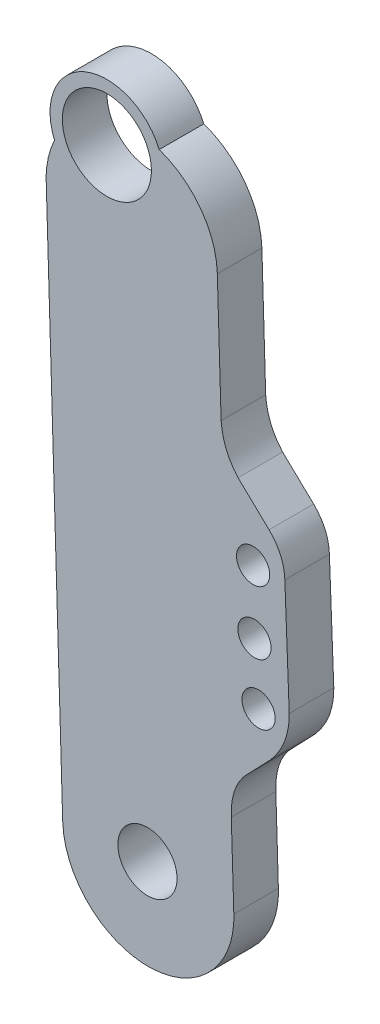
ISO-10303-21;
HEADER;
FILE_DESCRIPTION(('STEP AP214'),'2;1');
FILE_NAME('part.step','',(''),(''),'','','');
FILE_SCHEMA(('AUTOMOTIVE_DESIGN { 1 0 10303 214 1 1 1 1 }'));
ENDSEC;
DATA;
#1=APPLICATION_CONTEXT('core data for automotive mechanical design processes');
#2=APPLICATION_PROTOCOL_DEFINITION('international standard','automotive_design',2000,#1);
#3=PRODUCT_CONTEXT('',#1,'mechanical');
#4=PRODUCT('Part','Part','',(#3));
#5=PRODUCT_RELATED_PRODUCT_CATEGORY('part','',(#4));
#6=PRODUCT_DEFINITION_FORMATION('','',#4);
#7=PRODUCT_DEFINITION_CONTEXT('part definition',#1,'design');
#8=PRODUCT_DEFINITION('design','',#6,#7);
#9=PRODUCT_DEFINITION_SHAPE('','',#8);
#10=(LENGTH_UNIT() NAMED_UNIT(*) SI_UNIT(.MILLI.,.METRE.));
#11=(NAMED_UNIT(*) PLANE_ANGLE_UNIT() SI_UNIT($,.RADIAN.));
#12=(NAMED_UNIT(*) SI_UNIT($,.STERADIAN.) SOLID_ANGLE_UNIT());
#13=UNCERTAINTY_MEASURE_WITH_UNIT(LENGTH_MEASURE(1.E-05),#10,'distance_accuracy_value','');
#14=(GEOMETRIC_REPRESENTATION_CONTEXT(3) GLOBAL_UNCERTAINTY_ASSIGNED_CONTEXT((#13)) GLOBAL_UNIT_ASSIGNED_CONTEXT((#10,
#11,#12)) REPRESENTATION_CONTEXT('',''));
#15=CARTESIAN_POINT('',(0.,0.,0.));
#16=DIRECTION('',(0.,0.,1.));
#17=DIRECTION('',(1.,0.,0.));
#18=AXIS2_PLACEMENT_3D('',#15,#16,#17);
#19=CARTESIAN_POINT('',(-388.059100523097,120.432749784163,6.24999999041382));
#20=DIRECTION('',(0.,0.,-1.));
#21=DIRECTION('',(-1.,0.,0.));
#22=AXIS2_PLACEMENT_3D('',#19,#20,#21);
#23=PLANE('',#22);
#24=CARTESIAN_POINT('',(-386.970619869403,123.610376700845,6.24999999041382));
#25=CARTESIAN_POINT('',(-387.932797668541,121.605030880743,6.24999999041382));
#26=CARTESIAN_POINT('',(-388.443804076776,119.350570309366,6.24999999041382));
#27=CARTESIAN_POINT('',(-388.372379079423,116.984818002134,6.24999999041382));
#28=B_SPLINE_CURVE_WITH_KNOTS('',3,(#24,#25,#26,#27),.UNSPECIFIED.,.F.,.F.,(4,4),
(0.894736842105263,1.),.UNSPECIFIED.);
#29=CARTESIAN_POINT('',(-386.970619869403,123.610376700845,6.24999999041382));
#30=VERTEX_POINT('',#29);
#31=CARTESIAN_POINT('',(-388.372379079423,116.984818002134,6.24999999041382));
#32=VERTEX_POINT('',#31);
#33=EDGE_CURVE('E299',#30,#32,#28,.T.);
#34=ORIENTED_EDGE('',*,*,#33,.T.);
#35=DIRECTION('',(0.0301678991929655,-0.999544845346262,0.));
#36=VECTOR('',#35,1.);
#37=CARTESIAN_POINT('',(-388.372379079423,116.984818002134,6.24999999041382));
#38=LINE('',#37,#36);
#39=CARTESIAN_POINT('',(-385.59706759871,25.0311732676039,6.24999999041382));
#40=VERTEX_POINT('',#39);
#41=EDGE_CURVE('E126',#32,#40,#38,.T.);
#42=ORIENTED_EDGE('',*,*,#41,.T.);
#43=CARTESIAN_POINT('',(-385.59706759871,25.0311732676039,6.24999999041382));
#44=CARTESIAN_POINT('',(-385.358006806006,17.1098408388166,6.24999999041382));
#45=CARTESIAN_POINT('',(-378.681410303714,10.8243712526231,6.24999999041382));
#46=CARTESIAN_POINT('',(-370.760008055769,11.0635018644832,6.24999999041382));
#47=B_SPLINE_CURVE_WITH_KNOTS('',3,(#43,#44,#45,#46),.UNSPECIFIED.,.F.,.F.,(4,4),
(0.0526315789473684,0.105263157894737),.UNSPECIFIED.);
#48=CARTESIAN_POINT('',(-370.760008055769,11.0635018644832,6.24999999041382));
#49=VERTEX_POINT('',#48);
#50=EDGE_CURVE('E286',#40,#49,#47,.T.);
#51=ORIENTED_EDGE('',*,*,#50,.T.);
#52=CARTESIAN_POINT('',(-370.760008055769,11.0635018644832,6.24999999041382));
#53=CARTESIAN_POINT('',(-362.838675626982,11.3025626571867,6.24999999041382));
#54=CARTESIAN_POINT('',(-356.549505625481,17.9793686169499,6.24999999041382));
#55=CARTESIAN_POINT('',(-356.792336652649,25.9005614074238,6.24999999041382));
#56=B_SPLINE_CURVE_WITH_KNOTS('',3,(#52,#53,#54,#55),.UNSPECIFIED.,.F.,.F.,(4,4),
(0.157894736842105,0.210526315789474),.UNSPECIFIED.);
#57=CARTESIAN_POINT('',(-356.792336652649,25.9005614074238,6.24999999041382));
#58=VERTEX_POINT('',#57);
#59=EDGE_CURVE('E281',#49,#58,#56,.T.);
#60=ORIENTED_EDGE('',*,*,#59,.T.);
#61=DIRECTION('',(-0.0306423259803313,0.999530413673598,0.));
#62=VECTOR('',#61,1.);
#63=CARTESIAN_POINT('',(-356.792336652649,25.9005614074238,6.24999999041382));
#64=LINE('',#63,#62);
#65=CARTESIAN_POINT('',(-357.219071338689,39.8203368690157,6.24999999041382));
#66=VERTEX_POINT('',#65);
#67=EDGE_CURVE('E262',#58,#66,#64,.T.);
#68=ORIENTED_EDGE('',*,*,#67,.T.);
#69=CARTESIAN_POINT('',(-357.219071338689,39.8203368690157,6.24999999041382));
#70=CARTESIAN_POINT('',(-357.34656111891,43.0680447642823,6.24999999041382));
#71=CARTESIAN_POINT('',(-356.363437572749,45.6466058612809,6.24999999041382));
#72=CARTESIAN_POINT('',(-354.343848644671,47.6006346011731,6.24999999041382));
#73=B_SPLINE_CURVE_WITH_KNOTS('',3,(#69,#70,#71,#72),.UNSPECIFIED.,.F.,.F.,(4,4),
(0.263157894736842,0.315789473684211),.UNSPECIFIED.);
#74=CARTESIAN_POINT('',(-354.343848644671,47.6006346011731,6.24999999041382));
#75=VERTEX_POINT('',#74);
#76=EDGE_CURVE('E256',#66,#75,#73,.T.);
#77=ORIENTED_EDGE('',*,*,#76,.T.);
#78=DIRECTION('',(0.693257305563202,0.720690161083977,0.));
#79=VECTOR('',#78,1.);
#80=CARTESIAN_POINT('',(-354.343848644671,47.6006346011731,6.24999999041382));
#81=LINE('',#80,#79);
#82=CARTESIAN_POINT('',(-350.594490108173,51.4983588457589,6.24999999041382));
#83=VERTEX_POINT('',#82);
#84=EDGE_CURVE('E250',#75,#83,#81,.T.);
#85=ORIENTED_EDGE('',*,*,#84,.T.);
#86=CARTESIAN_POINT('',(-350.594490108173,51.4983588457589,6.24999999041382));
#87=CARTESIAN_POINT('',(-348.580765989262,53.8347871071572,6.24999999041382));
#88=CARTESIAN_POINT('',(-347.434195797155,56.5603175291092,6.24999999041382));
#89=CARTESIAN_POINT('',(-347.465474779377,59.8142393293264,6.24999999041382));
#90=B_SPLINE_CURVE_WITH_KNOTS('',3,(#86,#87,#88,#89),.UNSPECIFIED.,.F.,.F.,(4,4),
(0.368421052631579,0.421052631578947),.UNSPECIFIED.);
#91=CARTESIAN_POINT('',(-347.465474779377,59.8142393293264,6.24999999041382));
#92=VERTEX_POINT('',#91);
#93=EDGE_CURVE('E244',#83,#92,#90,.T.);
#94=ORIENTED_EDGE('',*,*,#93,.T.);
#95=DIRECTION('',(-0.038627834002879,0.999253666713436,0.));
#96=VECTOR('',#95,1.);
#97=CARTESIAN_POINT('',(-347.465474779377,59.8142393293264,6.24999999041382));
#98=LINE('',#97,#96);
#99=CARTESIAN_POINT('',(-348.203812361982,78.9141074874854,6.24999999041382));
#100=VERTEX_POINT('',#99);
#101=EDGE_CURVE('E225',#92,#100,#98,.T.);
#102=ORIENTED_EDGE('',*,*,#101,.T.);
#103=CARTESIAN_POINT('',(-348.203812361982,78.9141074874854,6.24999999041382));
#104=CARTESIAN_POINT('',(-348.281521083442,81.1967051790313,6.24999999041382));
#105=CARTESIAN_POINT('',(-349.142949839393,83.1989789562361,6.24999999041382));
#106=CARTESIAN_POINT('',(-350.857498871641,84.895933560984,6.24999999041382));
#107=B_SPLINE_CURVE_WITH_KNOTS('',3,(#103,#104,#105,#106),.UNSPECIFIED.,.F.,.F.,(4,4),
(0.473684210526316,0.526315789473684),.UNSPECIFIED.);
#108=CARTESIAN_POINT('',(-350.857498871641,84.895933560984,6.24999999041382));
#109=VERTEX_POINT('',#108);
#110=EDGE_CURVE('E219',#100,#109,#107,.T.);
#111=ORIENTED_EDGE('',*,*,#110,.T.);
#112=DIRECTION('',(-0.724374994776836,0.689406169788216,0.));
#113=VECTOR('',#112,1.);
#114=CARTESIAN_POINT('',(-350.857498871641,84.895933560984,6.24999999041382));
#115=LINE('',#114,#113);
#116=CARTESIAN_POINT('',(-356.077179030084,89.8636363827252,6.24999999041382));
#117=VERTEX_POINT('',#116);
#118=EDGE_CURVE('E213',#109,#117,#115,.T.);
#119=ORIENTED_EDGE('',*,*,#118,.T.);
#120=CARTESIAN_POINT('',(-356.077179030084,89.8636363827252,6.24999999041382));
#121=CARTESIAN_POINT('',(-357.906859851809,91.8868559069542,6.24999999041382));
#122=CARTESIAN_POINT('',(-358.735054689148,94.2315228288487,6.24999999041382));
#123=CARTESIAN_POINT('',(-358.931525796235,96.7790144010947,6.24999999041382));
#124=B_SPLINE_CURVE_WITH_KNOTS('',3,(#120,#121,#122,#123),.UNSPECIFIED.,.F.,.F.,(4,4),
(0.578947368421053,0.631578947368421),.UNSPECIFIED.);
#125=CARTESIAN_POINT('',(-358.931525796235,96.7790144010947,6.24999999041382));
#126=VERTEX_POINT('',#125);
#127=EDGE_CURVE('E166',#117,#126,#124,.T.);
#128=ORIENTED_EDGE('',*,*,#127,.T.);
#129=DIRECTION('',(-0.0301696265125634,0.999544793211436,0.));
#130=VECTOR('',#129,1.);
#131=CARTESIAN_POINT('',(-358.931525796235,96.7790144010947,6.24999999041382));
#132=LINE('',#131,#130);
#133=CARTESIAN_POINT('',(-359.567648133362,117.854275961111,6.24999999041382));
#134=VERTEX_POINT('',#133);
#135=EDGE_CURVE('E160',#126,#134,#132,.T.);
#136=ORIENTED_EDGE('',*,*,#135,.T.);
#137=CARTESIAN_POINT('',(-359.567648133362,117.854275961111,6.24999999041382));
#138=CARTESIAN_POINT('',(-359.753436909467,124.010719745635,6.24999999041382));
#139=CARTESIAN_POINT('',(-363.828362173878,129.178524270614,6.24999999041382));
#140=CARTESIAN_POINT('',(-369.353640781404,131.063501864483,6.24999999041382));
#141=B_SPLINE_CURVE_WITH_KNOTS('',3,(#137,#138,#139,#140),.UNSPECIFIED.,.F.,.F.,(4,4),
(0.684210526315789,0.736842105263158),.UNSPECIFIED.);
#142=CARTESIAN_POINT('',(-369.353640781404,131.063501864483,6.24999999041382));
#143=VERTEX_POINT('',#142);
#144=EDGE_CURVE('E164',#134,#143,#141,.T.);
#145=ORIENTED_EDGE('',*,*,#144,.T.);
#146=CARTESIAN_POINT('',(-378.162130325404,127.336939282664,6.24999999041382));
#147=DIRECTION('',(0.,0.,1.));
#148=DIRECTION('',(1.,0.,0.));
#149=AXIS2_PLACEMENT_3D('',#146,#147,#148);
#150=CIRCLE('',#149,9.5643482121347);
#151=EDGE_CURVE('E62',#143,#30,#150,.T.);
#152=ORIENTED_EDGE('',*,*,#151,.T.);
#153=EDGE_LOOP('',(#34,#42,#51,#60,#68,#77,#85,#94,#102,#111,#119,#128,#136,#145,#152));
#154=FACE_BOUND('',#153,.T.);
#155=CARTESIAN_POINT('',(-378.162130325404,127.336939282664,6.24999999041382));
#156=DIRECTION('',(0.,0.,1.));
#157=DIRECTION('',(1.,0.,0.));
#158=AXIS2_PLACEMENT_3D('',#155,#156,#157);
#159=CIRCLE('',#158,7.49999999999999);
#160=CARTESIAN_POINT('',(-370.662130325404,127.336939282664,6.24999999041382));
#161=VERTEX_POINT('',#160);
#162=EDGE_CURVE('E312',#161,#161,#159,.T.);
#163=ORIENTED_EDGE('',*,*,#162,.F.);
#164=EDGE_LOOP('',(#163));
#165=FACE_BOUND('',#164,.T.);
#166=CARTESIAN_POINT('',(-353.548093275784,78.3557620384497,6.24999999041382));
#167=DIRECTION('',(0.,0.,1.));
#168=DIRECTION('',(1.,0.,0.));
#169=AXIS2_PLACEMENT_3D('',#166,#167,#168);
#170=CIRCLE('',#169,2.79036467951717);
#171=CARTESIAN_POINT('',(-350.757728596267,78.3557620384497,6.24999999041382));
#172=VERTEX_POINT('',#171);
#173=EDGE_CURVE('E313',#172,#172,#170,.T.);
#174=ORIENTED_EDGE('',*,*,#173,.F.);
#175=EDGE_LOOP('',(#174));
#176=FACE_BOUND('',#175,.T.);
#177=CARTESIAN_POINT('',(-353.318044614741,67.8227119319341,6.24999999041382));
#178=DIRECTION('',(0.,0.,1.));
#179=DIRECTION('',(1.,0.,0.));
#180=AXIS2_PLACEMENT_3D('',#177,#178,#179);
#181=CIRCLE('',#180,2.79953730405472);
#182=CARTESIAN_POINT('',(-350.518507310686,67.8227119319341,6.24999999041382));
#183=VERTEX_POINT('',#182);
#184=EDGE_CURVE('E322',#183,#183,#181,.T.);
#185=ORIENTED_EDGE('',*,*,#184,.F.);
#186=EDGE_LOOP('',(#185));
#187=FACE_BOUND('',#186,.T.);
#188=CARTESIAN_POINT('',(-352.629189205041,57.8932525864358,6.24999999041382));
#189=DIRECTION('',(0.,0.,1.));
#190=DIRECTION('',(1.,0.,0.));
#191=AXIS2_PLACEMENT_3D('',#188,#189,#190);
#192=CIRCLE('',#191,2.79386548582838);
#193=CARTESIAN_POINT('',(-349.835323719213,57.8932525864358,6.24999999041382));
#194=VERTEX_POINT('',#193);
#195=EDGE_CURVE('E330',#194,#194,#192,.T.);
#196=ORIENTED_EDGE('',*,*,#195,.F.);
#197=EDGE_LOOP('',(#196));
#198=FACE_BOUND('',#197,.T.);
#199=CARTESIAN_POINT('',(-371.328245941671,26.2939343991224,6.24999999041382));
#200=DIRECTION('',(0.,0.,1.));
#201=DIRECTION('',(1.,0.,0.));
#202=AXIS2_PLACEMENT_3D('',#199,#200,#201);
#203=CIRCLE('',#202,4.97924899846735);
#204=CARTESIAN_POINT('',(-366.348996943203,26.2939343991224,6.24999999041382));
#205=VERTEX_POINT('',#204);
#206=EDGE_CURVE('E338',#205,#205,#203,.T.);
#207=ORIENTED_EDGE('',*,*,#206,.F.);
#208=EDGE_LOOP('',(#207));
#209=FACE_BOUND('',#208,.T.);
#210=ADVANCED_FACE('F43',(#154,#165,#176,#187,#198,#209),#23,.F.);
#211=CARTESIAN_POINT('',(-388.059100523097,120.432749784163,-1.25000000958618));
#212=DIRECTION('',(0.,0.,-1.));
#213=DIRECTION('',(-1.,0.,0.));
#214=AXIS2_PLACEMENT_3D('',#211,#212,#213);
#215=PLANE('',#214);
#216=CARTESIAN_POINT('',(-352.629189205041,57.8932525864358,-1.25000000958618));
#217=DIRECTION('',(0.,0.,1.));
#218=DIRECTION('',(1.,0.,0.));
#219=AXIS2_PLACEMENT_3D('',#216,#217,#218);
#220=CIRCLE('',#219,2.79386548582838);
#221=CARTESIAN_POINT('',(-349.835323719213,57.8932525864358,-1.25000000958618));
#222=VERTEX_POINT('',#221);
#223=EDGE_CURVE('E334',#222,#222,#220,.T.);
#224=ORIENTED_EDGE('',*,*,#223,.T.);
#225=EDGE_LOOP('',(#224));
#226=FACE_BOUND('',#225,.T.);
#227=CARTESIAN_POINT('',(-353.548093275784,78.3557620384497,-1.25000000958618));
#228=DIRECTION('',(0.,0.,1.));
#229=DIRECTION('',(1.,0.,0.));
#230=AXIS2_PLACEMENT_3D('',#227,#228,#229);
#231=CIRCLE('',#230,2.79036467951717);
#232=CARTESIAN_POINT('',(-350.757728596267,78.3557620384497,-1.25000000958618));
#233=VERTEX_POINT('',#232);
#234=EDGE_CURVE('E318',#233,#233,#231,.T.);
#235=ORIENTED_EDGE('',*,*,#234,.T.);
#236=EDGE_LOOP('',(#235));
#237=FACE_BOUND('',#236,.T.);
#238=CARTESIAN_POINT('',(-386.970619869403,123.610376700845,-1.25000000958618));
#239=CARTESIAN_POINT('',(-387.932797668541,121.605030880743,-1.25000000958618));
#240=CARTESIAN_POINT('',(-388.443804076776,119.350570309366,-1.25000000958618));
#241=CARTESIAN_POINT('',(-388.372379079423,116.984818002134,-1.25000000958618));
#242=B_SPLINE_CURVE_WITH_KNOTS('',3,(#238,#239,#240,#241),.UNSPECIFIED.,.F.,.F.,(4,4),
(0.894736842105263,1.),.UNSPECIFIED.);
#243=CARTESIAN_POINT('',(-386.970619869403,123.610376700845,-1.25000000958618));
#244=VERTEX_POINT('',#243);
#245=CARTESIAN_POINT('',(-388.372379079423,116.984818002134,-1.25000000958618));
#246=VERTEX_POINT('',#245);
#247=EDGE_CURVE('E317',#244,#246,#242,.T.);
#248=ORIENTED_EDGE('',*,*,#247,.F.);
#249=CARTESIAN_POINT('',(-378.162130325404,127.336939282664,-1.25000000958618));
#250=DIRECTION('',(0.,0.,1.));
#251=DIRECTION('',(1.,0.,0.));
#252=AXIS2_PLACEMENT_3D('',#249,#250,#251);
#253=CIRCLE('',#252,9.5643482121347);
#254=CARTESIAN_POINT('',(-369.353640781404,131.063501864483,-1.25000000958618));
#255=VERTEX_POINT('',#254);
#256=EDGE_CURVE('E118',#255,#244,#253,.T.);
#257=ORIENTED_EDGE('',*,*,#256,.F.);
#258=CARTESIAN_POINT('',(-359.567648133362,117.854275961111,-1.25000000958618));
#259=CARTESIAN_POINT('',(-359.753436909467,124.010719745635,-1.25000000958618));
#260=CARTESIAN_POINT('',(-363.828362173878,129.178524270614,-1.25000000958618));
#261=CARTESIAN_POINT('',(-369.353640781404,131.063501864483,-1.25000000958618));
#262=B_SPLINE_CURVE_WITH_KNOTS('',3,(#258,#259,#260,#261),.UNSPECIFIED.,.F.,.F.,(4,4),
(0.684210526315789,0.736842105263158),.UNSPECIFIED.);
#263=CARTESIAN_POINT('',(-359.567648133362,117.854275961111,-1.25000000958618));
#264=VERTEX_POINT('',#263);
#265=EDGE_CURVE('E112',#264,#255,#262,.T.);
#266=ORIENTED_EDGE('',*,*,#265,.F.);
#267=DIRECTION('',(-0.0301696265125634,0.999544793211436,0.));
#268=VECTOR('',#267,1.);
#269=CARTESIAN_POINT('',(-358.931525796235,96.7790144010947,-1.25000000958618));
#270=LINE('',#269,#268);
#271=CARTESIAN_POINT('',(-358.931525796235,96.7790144010947,-1.25000000958618));
#272=VERTEX_POINT('',#271);
#273=EDGE_CURVE('E175',#272,#264,#270,.T.);
#274=ORIENTED_EDGE('',*,*,#273,.F.);
#275=CARTESIAN_POINT('',(-356.077179030084,89.8636363827252,-1.25000000958618));
#276=CARTESIAN_POINT('',(-357.906859851809,91.8868559069542,-1.25000000958618));
#277=CARTESIAN_POINT('',(-358.735054689148,94.2315228288487,-1.25000000958618));
#278=CARTESIAN_POINT('',(-358.931525796235,96.7790144010947,-1.25000000958618));
#279=B_SPLINE_CURVE_WITH_KNOTS('',3,(#275,#276,#277,#278),.UNSPECIFIED.,.F.,.F.,(4,4),
(0.578947368421053,0.631578947368421),.UNSPECIFIED.);
#280=CARTESIAN_POINT('',(-356.077179030084,89.8636363827252,-1.25000000958618));
#281=VERTEX_POINT('',#280);
#282=EDGE_CURVE('E586',#281,#272,#279,.T.);
#283=ORIENTED_EDGE('',*,*,#282,.F.);
#284=DIRECTION('',(-0.724374994776836,0.689406169788216,0.));
#285=VECTOR('',#284,1.);
#286=CARTESIAN_POINT('',(-350.857498871641,84.895933560984,-1.25000000958618));
#287=LINE('',#286,#285);
#288=CARTESIAN_POINT('',(-350.857498871641,84.895933560984,-1.25000000958618));
#289=VERTEX_POINT('',#288);
#290=EDGE_CURVE('E580',#289,#281,#287,.T.);
#291=ORIENTED_EDGE('',*,*,#290,.F.);
#292=CARTESIAN_POINT('',(-348.203812361982,78.9141074874854,-1.25000000958618));
#293=CARTESIAN_POINT('',(-348.281521083442,81.1967051790313,-1.25000000958618));
#294=CARTESIAN_POINT('',(-349.142949839393,83.1989789562361,-1.25000000958618));
#295=CARTESIAN_POINT('',(-350.857498871641,84.895933560984,-1.25000000958618));
#296=B_SPLINE_CURVE_WITH_KNOTS('',3,(#292,#293,#294,#295),.UNSPECIFIED.,.F.,.F.,(4,4),
(0.473684210526316,0.526315789473684),.UNSPECIFIED.);
#297=CARTESIAN_POINT('',(-348.203812361982,78.9141074874854,-1.25000000958618));
#298=VERTEX_POINT('',#297);
#299=EDGE_CURVE('E575',#298,#289,#296,.T.);
#300=ORIENTED_EDGE('',*,*,#299,.F.);
#301=DIRECTION('',(-0.038627834002879,0.999253666713436,0.));
#302=VECTOR('',#301,1.);
#303=CARTESIAN_POINT('',(-347.465474779377,59.8142393293264,-1.25000000958618));
#304=LINE('',#303,#302);
#305=CARTESIAN_POINT('',(-347.465474779377,59.8142393293264,-1.25000000958618));
#306=VERTEX_POINT('',#305);
#307=EDGE_CURVE('E569',#306,#298,#304,.T.);
#308=ORIENTED_EDGE('',*,*,#307,.F.);
#309=CARTESIAN_POINT('',(-350.594490108173,51.4983588457589,-1.25000000958618));
#310=CARTESIAN_POINT('',(-348.580765989262,53.8347871071572,-1.25000000958618));
#311=CARTESIAN_POINT('',(-347.434195797155,56.5603175291092,-1.25000000958618));
#312=CARTESIAN_POINT('',(-347.465474779377,59.8142393293264,-1.25000000958618));
#313=B_SPLINE_CURVE_WITH_KNOTS('',3,(#309,#310,#311,#312),.UNSPECIFIED.,.F.,.F.,(4,4),
(0.368421052631579,0.421052631578947),.UNSPECIFIED.);
#314=CARTESIAN_POINT('',(-350.594490108173,51.4983588457589,-1.25000000958618));
#315=VERTEX_POINT('',#314);
#316=EDGE_CURVE('E564',#315,#306,#313,.T.);
#317=ORIENTED_EDGE('',*,*,#316,.F.);
#318=DIRECTION('',(0.693257305563202,0.720690161083977,0.));
#319=VECTOR('',#318,1.);
#320=CARTESIAN_POINT('',(-354.343848644671,47.6006346011731,-1.25000000958618));
#321=LINE('',#320,#319);
#322=CARTESIAN_POINT('',(-354.343848644671,47.6006346011731,-1.25000000958618));
#323=VERTEX_POINT('',#322);
#324=EDGE_CURVE('E558',#323,#315,#321,.T.);
#325=ORIENTED_EDGE('',*,*,#324,.F.);
#326=CARTESIAN_POINT('',(-357.219071338689,39.8203368690157,-1.25000000958618));
#327=CARTESIAN_POINT('',(-357.34656111891,43.0680447642823,-1.25000000958618));
#328=CARTESIAN_POINT('',(-356.363437572749,45.6466058612809,-1.25000000958618));
#329=CARTESIAN_POINT('',(-354.343848644671,47.6006346011731,-1.25000000958618));
#330=B_SPLINE_CURVE_WITH_KNOTS('',3,(#326,#327,#328,#329),.UNSPECIFIED.,.F.,.F.,(4,4),
(0.263157894736842,0.315789473684211),.UNSPECIFIED.);
#331=CARTESIAN_POINT('',(-357.219071338689,39.8203368690157,-1.25000000958618));
#332=VERTEX_POINT('',#331);
#333=EDGE_CURVE('E553',#332,#323,#330,.T.);
#334=ORIENTED_EDGE('',*,*,#333,.F.);
#335=DIRECTION('',(-0.0306423259803313,0.999530413673598,0.));
#336=VECTOR('',#335,1.);
#337=CARTESIAN_POINT('',(-356.792336652649,25.9005614074238,-1.25000000958618));
#338=LINE('',#337,#336);
#339=CARTESIAN_POINT('',(-356.792336652649,25.9005614074238,-1.25000000958618));
#340=VERTEX_POINT('',#339);
#341=EDGE_CURVE('E547',#340,#332,#338,.T.);
#342=ORIENTED_EDGE('',*,*,#341,.F.);
#343=CARTESIAN_POINT('',(-370.760008055769,11.0635018644832,-1.25000000958618));
#344=CARTESIAN_POINT('',(-362.838675626982,11.3025626571867,-1.25000000958618));
#345=CARTESIAN_POINT('',(-356.549505625481,17.9793686169499,-1.25000000958618));
#346=CARTESIAN_POINT('',(-356.792336652649,25.9005614074238,-1.25000000958618));
#347=B_SPLINE_CURVE_WITH_KNOTS('',3,(#343,#344,#345,#346),.UNSPECIFIED.,.F.,.F.,(4,4),
(0.157894736842105,0.210526315789474),.UNSPECIFIED.);
#348=CARTESIAN_POINT('',(-370.760008055769,11.0635018644832,-1.25000000958618));
#349=VERTEX_POINT('',#348);
#350=EDGE_CURVE('E539',#349,#340,#347,.T.);
#351=ORIENTED_EDGE('',*,*,#350,.F.);
#352=CARTESIAN_POINT('',(-385.59706759871,25.0311732676039,-1.25000000958618));
#353=CARTESIAN_POINT('',(-385.358006806006,17.1098408388166,-1.25000000958618));
#354=CARTESIAN_POINT('',(-378.681410303714,10.8243712526231,-1.25000000958618));
#355=CARTESIAN_POINT('',(-370.760008055769,11.0635018644832,-1.25000000958618));
#356=B_SPLINE_CURVE_WITH_KNOTS('',3,(#352,#353,#354,#355),.UNSPECIFIED.,.F.,.F.,(4,4),
(0.0526315789473684,0.105263157894737),.UNSPECIFIED.);
#357=CARTESIAN_POINT('',(-385.59706759871,25.0311732676039,-1.25000000958618));
#358=VERTEX_POINT('',#357);
#359=EDGE_CURVE('E527',#358,#349,#356,.T.);
#360=ORIENTED_EDGE('',*,*,#359,.F.);
#361=DIRECTION('',(0.0301678991929655,-0.999544845346262,0.));
#362=VECTOR('',#361,1.);
#363=CARTESIAN_POINT('',(-388.372379079423,116.984818002134,-1.25000000958618));
#364=LINE('',#363,#362);
#365=EDGE_CURVE('E525',#246,#358,#364,.T.);
#366=ORIENTED_EDGE('',*,*,#365,.F.);
#367=EDGE_LOOP('',(#248,#257,#266,#274,#283,#291,#300,#308,#317,#325,#334,#342,#351,#360,#366));
#368=FACE_BOUND('',#367,.T.);
#369=CARTESIAN_POINT('',(-378.162130325404,127.336939282664,-1.25000000958618));
#370=DIRECTION('',(0.,0.,1.));
#371=DIRECTION('',(1.,0.,0.));
#372=AXIS2_PLACEMENT_3D('',#369,#370,#371);
#373=CIRCLE('',#372,7.49999999999999);
#374=CARTESIAN_POINT('',(-370.662130325404,127.336939282664,-1.25000000958618));
#375=VERTEX_POINT('',#374);
#376=EDGE_CURVE('E305',#375,#375,#373,.T.);
#377=ORIENTED_EDGE('',*,*,#376,.T.);
#378=EDGE_LOOP('',(#377));
#379=FACE_BOUND('',#378,.T.);
#380=CARTESIAN_POINT('',(-353.318044614741,67.8227119319341,-1.25000000958618));
#381=DIRECTION('',(0.,0.,1.));
#382=DIRECTION('',(1.,0.,0.));
#383=AXIS2_PLACEMENT_3D('',#380,#381,#382);
#384=CIRCLE('',#383,2.79953730405472);
#385=CARTESIAN_POINT('',(-350.518507310686,67.8227119319341,-1.25000000958618));
#386=VERTEX_POINT('',#385);
#387=EDGE_CURVE('E326',#386,#386,#384,.T.);
#388=ORIENTED_EDGE('',*,*,#387,.T.);
#389=EDGE_LOOP('',(#388));
#390=FACE_BOUND('',#389,.T.);
#391=CARTESIAN_POINT('',(-371.328245941671,26.2939343991224,-1.25000000958618));
#392=DIRECTION('',(0.,0.,1.));
#393=DIRECTION('',(1.,0.,0.));
#394=AXIS2_PLACEMENT_3D('',#391,#392,#393);
#395=CIRCLE('',#394,4.97924899846735);
#396=CARTESIAN_POINT('',(-366.348996943203,26.2939343991224,-1.25000000958618));
#397=VERTEX_POINT('',#396);
#398=EDGE_CURVE('E342',#397,#397,#395,.T.);
#399=ORIENTED_EDGE('',*,*,#398,.T.);
#400=EDGE_LOOP('',(#399));
#401=FACE_BOUND('',#400,.T.);
#402=ADVANCED_FACE('F354',(#226,#237,#368,#379,#390,#401),#215,.T.);
#403=DIRECTION('',(0.,0.,-1.));
#404=VECTOR('',#403,1.);
#405=SURFACE_OF_LINEAR_EXTRUSION('',#28,#404);
#406=ORIENTED_EDGE('',*,*,#247,.T.);
#407=DIRECTION('',(0.,0.,-1.));
#408=VECTOR('',#407,1.);
#409=CARTESIAN_POINT('',(-388.372379079423,116.984818002134,6.24999999041382));
#410=LINE('',#409,#408);
#411=EDGE_CURVE('E11',#32,#246,#410,.T.);
#412=ORIENTED_EDGE('',*,*,#411,.F.);
#413=ORIENTED_EDGE('',*,*,#33,.F.);
#414=DIRECTION('',(0.,0.,-1.));
#415=VECTOR('',#414,1.);
#416=CARTESIAN_POINT('',(-386.970619869403,123.610376700845,6.24999999041382));
#417=LINE('',#416,#415);
#418=EDGE_CURVE('E184',#30,#244,#417,.T.);
#419=ORIENTED_EDGE('',*,*,#418,.T.);
#420=EDGE_LOOP('',(#406,#412,#413,#419));
#421=FACE_BOUND('',#420,.T.);
#422=ADVANCED_FACE('F45',(#421),#405,.F.);
#423=CARTESIAN_POINT('',(-388.372379079423,116.984818002134,6.24999999041382));
#424=DIRECTION('',(0.999544845346262,0.0301678991929655,0.));
#425=DIRECTION('',(-0.0301678991929655,0.999544845346262,0.));
#426=AXIS2_PLACEMENT_3D('',#423,#424,#425);
#427=PLANE('',#426);
#428=ORIENTED_EDGE('',*,*,#365,.T.);
#429=DIRECTION('',(0.,0.,-1.));
#430=VECTOR('',#429,1.);
#431=CARTESIAN_POINT('',(-385.59706759871,25.0311732676039,6.24999999041382));
#432=LINE('',#431,#430);
#433=EDGE_CURVE('E54',#40,#358,#432,.T.);
#434=ORIENTED_EDGE('',*,*,#433,.F.);
#435=ORIENTED_EDGE('',*,*,#41,.F.);
#436=ORIENTED_EDGE('',*,*,#411,.T.);
#437=EDGE_LOOP('',(#428,#434,#435,#436));
#438=FACE_BOUND('',#437,.T.);
#439=ADVANCED_FACE('F455',(#438),#427,.F.);
#440=DIRECTION('',(0.,0.,-1.));
#441=VECTOR('',#440,1.);
#442=SURFACE_OF_LINEAR_EXTRUSION('',#47,#441);
#443=ORIENTED_EDGE('',*,*,#359,.T.);
#444=DIRECTION('',(0.,0.,-1.));
#445=VECTOR('',#444,1.);
#446=CARTESIAN_POINT('',(-370.760008055769,11.0635018644832,6.24999999041382));
#447=LINE('',#446,#445);
#448=EDGE_CURVE('E643',#49,#349,#447,.T.);
#449=ORIENTED_EDGE('',*,*,#448,.F.);
#450=ORIENTED_EDGE('',*,*,#50,.F.);
#451=ORIENTED_EDGE('',*,*,#433,.T.);
#452=EDGE_LOOP('',(#443,#449,#450,#451));
#453=FACE_BOUND('',#452,.T.);
#454=ADVANCED_FACE('F278',(#453),#442,.F.);
#455=DIRECTION('',(0.,0.,-1.));
#456=VECTOR('',#455,1.);
#457=SURFACE_OF_LINEAR_EXTRUSION('',#56,#456);
#458=ORIENTED_EDGE('',*,*,#350,.T.);
#459=DIRECTION('',(0.,0.,-1.));
#460=VECTOR('',#459,1.);
#461=CARTESIAN_POINT('',(-356.792336652649,25.9005614074238,6.24999999041382));
#462=LINE('',#461,#460);
#463=EDGE_CURVE('E639',#58,#340,#462,.T.);
#464=ORIENTED_EDGE('',*,*,#463,.F.);
#465=ORIENTED_EDGE('',*,*,#59,.F.);
#466=ORIENTED_EDGE('',*,*,#448,.T.);
#467=EDGE_LOOP('',(#458,#464,#465,#466));
#468=FACE_BOUND('',#467,.T.);
#469=ADVANCED_FACE('F274',(#468),#457,.F.);
#470=CARTESIAN_POINT('',(-356.792336652649,25.9005614074238,6.24999999041382));
#471=DIRECTION('',(-0.999530413673599,-0.0306423259803313,0.));
#472=DIRECTION('',(0.0306423259803313,-0.999530413673599,0.));
#473=AXIS2_PLACEMENT_3D('',#470,#471,#472);
#474=PLANE('',#473);
#475=ORIENTED_EDGE('',*,*,#341,.T.);
#476=DIRECTION('',(0.,0.,-1.));
#477=VECTOR('',#476,1.);
#478=CARTESIAN_POINT('',(-357.219071338689,39.8203368690157,6.24999999041382));
#479=LINE('',#478,#477);
#480=EDGE_CURVE('E635',#66,#332,#479,.T.);
#481=ORIENTED_EDGE('',*,*,#480,.F.);
#482=ORIENTED_EDGE('',*,*,#67,.F.);
#483=ORIENTED_EDGE('',*,*,#463,.T.);
#484=EDGE_LOOP('',(#475,#481,#482,#483));
#485=FACE_BOUND('',#484,.T.);
#486=ADVANCED_FACE('F270',(#485),#474,.F.);
#487=DIRECTION('',(0.,0.,-1.));
#488=VECTOR('',#487,1.);
#489=SURFACE_OF_LINEAR_EXTRUSION('',#73,#488);
#490=ORIENTED_EDGE('',*,*,#333,.T.);
#491=DIRECTION('',(0.,0.,-1.));
#492=VECTOR('',#491,1.);
#493=CARTESIAN_POINT('',(-354.343848644671,47.6006346011731,6.24999999041382));
#494=LINE('',#493,#492);
#495=EDGE_CURVE('E631',#75,#323,#494,.T.);
#496=ORIENTED_EDGE('',*,*,#495,.F.);
#497=ORIENTED_EDGE('',*,*,#76,.F.);
#498=ORIENTED_EDGE('',*,*,#480,.T.);
#499=EDGE_LOOP('',(#490,#496,#497,#498));
#500=FACE_BOUND('',#499,.T.);
#501=ADVANCED_FACE('F267',(#500),#489,.F.);
#502=CARTESIAN_POINT('',(-354.343848644671,47.6006346011731,6.24999999041382));
#503=DIRECTION('',(-0.720690161083977,0.693257305563202,0.));
#504=DIRECTION('',(-0.693257305563202,-0.720690161083977,0.));
#505=AXIS2_PLACEMENT_3D('',#502,#503,#504);
#506=PLANE('',#505);
#507=ORIENTED_EDGE('',*,*,#324,.T.);
#508=DIRECTION('',(0.,0.,-1.));
#509=VECTOR('',#508,1.);
#510=CARTESIAN_POINT('',(-350.594490108173,51.4983588457589,6.24999999041382));
#511=LINE('',#510,#509);
#512=EDGE_CURVE('E627',#83,#315,#511,.T.);
#513=ORIENTED_EDGE('',*,*,#512,.F.);
#514=ORIENTED_EDGE('',*,*,#84,.F.);
#515=ORIENTED_EDGE('',*,*,#495,.T.);
#516=EDGE_LOOP('',(#507,#513,#514,#515));
#517=FACE_BOUND('',#516,.T.);
#518=ADVANCED_FACE('F241',(#517),#506,.F.);
#519=DIRECTION('',(0.,0.,-1.));
#520=VECTOR('',#519,1.);
#521=SURFACE_OF_LINEAR_EXTRUSION('',#90,#520);
#522=ORIENTED_EDGE('',*,*,#316,.T.);
#523=DIRECTION('',(0.,0.,-1.));
#524=VECTOR('',#523,1.);
#525=CARTESIAN_POINT('',(-347.465474779377,59.8142393293264,6.24999999041382));
#526=LINE('',#525,#524);
#527=EDGE_CURVE('E623',#92,#306,#526,.T.);
#528=ORIENTED_EDGE('',*,*,#527,.F.);
#529=ORIENTED_EDGE('',*,*,#93,.F.);
#530=ORIENTED_EDGE('',*,*,#512,.T.);
#531=EDGE_LOOP('',(#522,#528,#529,#530));
#532=FACE_BOUND('',#531,.T.);
#533=ADVANCED_FACE('F237',(#532),#521,.F.);
#534=CARTESIAN_POINT('',(-347.465474779377,59.8142393293264,6.24999999041382));
#535=DIRECTION('',(-0.999253666713436,-0.038627834002879,0.));
#536=DIRECTION('',(0.038627834002879,-0.999253666713436,0.));
#537=AXIS2_PLACEMENT_3D('',#534,#535,#536);
#538=PLANE('',#537);
#539=ORIENTED_EDGE('',*,*,#307,.T.);
#540=DIRECTION('',(0.,0.,-1.));
#541=VECTOR('',#540,1.);
#542=CARTESIAN_POINT('',(-348.203812361982,78.9141074874854,6.24999999041382));
#543=LINE('',#542,#541);
#544=EDGE_CURVE('E619',#100,#298,#543,.T.);
#545=ORIENTED_EDGE('',*,*,#544,.F.);
#546=ORIENTED_EDGE('',*,*,#101,.F.);
#547=ORIENTED_EDGE('',*,*,#527,.T.);
#548=EDGE_LOOP('',(#539,#545,#546,#547));
#549=FACE_BOUND('',#548,.T.);
#550=ADVANCED_FACE('F233',(#549),#538,.F.);
#551=DIRECTION('',(0.,0.,-1.));
#552=VECTOR('',#551,1.);
#553=SURFACE_OF_LINEAR_EXTRUSION('',#107,#552);
#554=ORIENTED_EDGE('',*,*,#299,.T.);
#555=DIRECTION('',(0.,0.,-1.));
#556=VECTOR('',#555,1.);
#557=CARTESIAN_POINT('',(-350.857498871641,84.895933560984,6.24999999041382));
#558=LINE('',#557,#556);
#559=EDGE_CURVE('E615',#109,#289,#558,.T.);
#560=ORIENTED_EDGE('',*,*,#559,.F.);
#561=ORIENTED_EDGE('',*,*,#110,.F.);
#562=ORIENTED_EDGE('',*,*,#544,.T.);
#563=EDGE_LOOP('',(#554,#560,#561,#562));
#564=FACE_BOUND('',#563,.T.);
#565=ADVANCED_FACE('F230',(#564),#553,.F.);
#566=CARTESIAN_POINT('',(-350.857498871641,84.895933560984,6.24999999041382));
#567=DIRECTION('',(-0.689406169788216,-0.724374994776836,0.));
#568=DIRECTION('',(0.724374994776836,-0.689406169788216,0.));
#569=AXIS2_PLACEMENT_3D('',#566,#567,#568);
#570=PLANE('',#569);
#571=ORIENTED_EDGE('',*,*,#290,.T.);
#572=DIRECTION('',(0.,0.,-1.));
#573=VECTOR('',#572,1.);
#574=CARTESIAN_POINT('',(-356.077179030084,89.8636363827252,6.24999999041382));
#575=LINE('',#574,#573);
#576=EDGE_CURVE('E611',#117,#281,#575,.T.);
#577=ORIENTED_EDGE('',*,*,#576,.F.);
#578=ORIENTED_EDGE('',*,*,#118,.F.);
#579=ORIENTED_EDGE('',*,*,#559,.T.);
#580=EDGE_LOOP('',(#571,#577,#578,#579));
#581=FACE_BOUND('',#580,.T.);
#582=ADVANCED_FACE('F205',(#581),#570,.F.);
#583=DIRECTION('',(0.,0.,-1.));
#584=VECTOR('',#583,1.);
#585=SURFACE_OF_LINEAR_EXTRUSION('',#124,#584);
#586=ORIENTED_EDGE('',*,*,#282,.T.);
#587=DIRECTION('',(0.,0.,-1.));
#588=VECTOR('',#587,1.);
#589=CARTESIAN_POINT('',(-358.931525796235,96.7790144010947,6.24999999041382));
#590=LINE('',#589,#588);
#591=EDGE_CURVE('E177',#126,#272,#590,.T.);
#592=ORIENTED_EDGE('',*,*,#591,.F.);
#593=ORIENTED_EDGE('',*,*,#127,.F.);
#594=ORIENTED_EDGE('',*,*,#576,.T.);
#595=EDGE_LOOP('',(#586,#592,#593,#594));
#596=FACE_BOUND('',#595,.T.);
#597=ADVANCED_FACE('F202',(#596),#585,.F.);
#598=CARTESIAN_POINT('',(-358.931525796235,96.7790144010947,6.24999999041382));
#599=DIRECTION('',(-0.999544793211436,-0.0301696265125634,0.));
#600=DIRECTION('',(0.0301696265125634,-0.999544793211436,0.));
#601=AXIS2_PLACEMENT_3D('',#598,#599,#600);
#602=PLANE('',#601);
#603=ORIENTED_EDGE('',*,*,#273,.T.);
#604=DIRECTION('',(0.,0.,-1.));
#605=VECTOR('',#604,1.);
#606=CARTESIAN_POINT('',(-359.567648133362,117.854275961111,6.24999999041382));
#607=LINE('',#606,#605);
#608=EDGE_CURVE('E172',#134,#264,#607,.T.);
#609=ORIENTED_EDGE('',*,*,#608,.F.);
#610=ORIENTED_EDGE('',*,*,#135,.F.);
#611=ORIENTED_EDGE('',*,*,#591,.T.);
#612=EDGE_LOOP('',(#603,#609,#610,#611));
#613=FACE_BOUND('',#612,.T.);
#614=ADVANCED_FACE('F173',(#613),#602,.F.);
#615=DIRECTION('',(0.,0.,-1.));
#616=VECTOR('',#615,1.);
#617=SURFACE_OF_LINEAR_EXTRUSION('',#141,#616);
#618=ORIENTED_EDGE('',*,*,#265,.T.);
#619=DIRECTION('',(0.,0.,-1.));
#620=VECTOR('',#619,1.);
#621=CARTESIAN_POINT('',(-369.353640781404,131.063501864483,6.24999999041382));
#622=LINE('',#621,#620);
#623=EDGE_CURVE('E178',#143,#255,#622,.T.);
#624=ORIENTED_EDGE('',*,*,#623,.F.);
#625=ORIENTED_EDGE('',*,*,#144,.F.);
#626=ORIENTED_EDGE('',*,*,#608,.T.);
#627=EDGE_LOOP('',(#618,#624,#625,#626));
#628=FACE_BOUND('',#627,.T.);
#629=ADVANCED_FACE('F180',(#628),#617,.F.);
#630=CARTESIAN_POINT('',(-378.162130325404,127.336939282664,6.24999999041382));
#631=DIRECTION('',(0.,0.,-1.));
#632=DIRECTION('',(-1.,0.,0.));
#633=AXIS2_PLACEMENT_3D('',#630,#631,#632);
#634=CYLINDRICAL_SURFACE('',#633,9.5643482121347);
#635=ORIENTED_EDGE('',*,*,#256,.T.);
#636=ORIENTED_EDGE('',*,*,#418,.F.);
#637=ORIENTED_EDGE('',*,*,#151,.F.);
#638=ORIENTED_EDGE('',*,*,#623,.T.);
#639=EDGE_LOOP('',(#635,#636,#637,#638));
#640=FACE_BOUND('',#639,.T.);
#641=ADVANCED_FACE('F198',(#640),#634,.T.);
#642=CARTESIAN_POINT('',(-378.162130325404,127.336939282664,6.24999999041382));
#643=DIRECTION('',(0.,0.,-1.));
#644=DIRECTION('',(-1.,0.,0.));
#645=AXIS2_PLACEMENT_3D('',#642,#643,#644);
#646=CYLINDRICAL_SURFACE('',#645,7.49999999999999);
#647=ORIENTED_EDGE('',*,*,#162,.T.);
#648=EDGE_LOOP('',(#647));
#649=FACE_BOUND('',#648,.T.);
#650=ORIENTED_EDGE('',*,*,#376,.F.);
#651=EDGE_LOOP('',(#650));
#652=FACE_BOUND('',#651,.T.);
#653=ADVANCED_FACE('F361',(#649,#652),#646,.F.);
#654=CARTESIAN_POINT('',(-353.548093275784,78.3557620384497,6.24999999041382));
#655=DIRECTION('',(0.,0.,-1.));
#656=DIRECTION('',(-1.,0.,0.));
#657=AXIS2_PLACEMENT_3D('',#654,#655,#656);
#658=CYLINDRICAL_SURFACE('',#657,2.79036467951717);
#659=ORIENTED_EDGE('',*,*,#173,.T.);
#660=EDGE_LOOP('',(#659));
#661=FACE_BOUND('',#660,.T.);
#662=ORIENTED_EDGE('',*,*,#234,.F.);
#663=EDGE_LOOP('',(#662));
#664=FACE_BOUND('',#663,.T.);
#665=ADVANCED_FACE('F364',(#661,#664),#658,.F.);
#666=CARTESIAN_POINT('',(-353.318044614741,67.8227119319341,6.24999999041382));
#667=DIRECTION('',(0.,0.,-1.));
#668=DIRECTION('',(-1.,0.,0.));
#669=AXIS2_PLACEMENT_3D('',#666,#667,#668);
#670=CYLINDRICAL_SURFACE('',#669,2.79953730405472);
#671=ORIENTED_EDGE('',*,*,#184,.T.);
#672=EDGE_LOOP('',(#671));
#673=FACE_BOUND('',#672,.T.);
#674=ORIENTED_EDGE('',*,*,#387,.F.);
#675=EDGE_LOOP('',(#674));
#676=FACE_BOUND('',#675,.T.);
#677=ADVANCED_FACE('F368',(#673,#676),#670,.F.);
#678=CARTESIAN_POINT('',(-352.629189205041,57.8932525864358,6.24999999041382));
#679=DIRECTION('',(0.,0.,-1.));
#680=DIRECTION('',(-1.,0.,0.));
#681=AXIS2_PLACEMENT_3D('',#678,#679,#680);
#682=CYLINDRICAL_SURFACE('',#681,2.79386548582838);
#683=ORIENTED_EDGE('',*,*,#195,.T.);
#684=EDGE_LOOP('',(#683));
#685=FACE_BOUND('',#684,.T.);
#686=ORIENTED_EDGE('',*,*,#223,.F.);
#687=EDGE_LOOP('',(#686));
#688=FACE_BOUND('',#687,.T.);
#689=ADVANCED_FACE('F372',(#685,#688),#682,.F.);
#690=CARTESIAN_POINT('',(-371.328245941671,26.2939343991224,6.24999999041382));
#691=DIRECTION('',(0.,0.,-1.));
#692=DIRECTION('',(-1.,0.,0.));
#693=AXIS2_PLACEMENT_3D('',#690,#691,#692);
#694=CYLINDRICAL_SURFACE('',#693,4.97924899846735);
#695=ORIENTED_EDGE('',*,*,#206,.T.);
#696=EDGE_LOOP('',(#695));
#697=FACE_BOUND('',#696,.T.);
#698=ORIENTED_EDGE('',*,*,#398,.F.);
#699=EDGE_LOOP('',(#698));
#700=FACE_BOUND('',#699,.T.);
#701=ADVANCED_FACE('F350',(#697,#700),#694,.F.);
#702=CLOSED_SHELL('',(#210,#402,#422,#439,#454,#469,#486,#501,#518,#533,#550,#565,#582,#597,
#614,#629,#641,#653,#665,#677,#689,#701));
#703=MANIFOLD_SOLID_BREP('B2',#702);
#704=ADVANCED_BREP_SHAPE_REPRESENTATION('',(#18,#703),#14);
#705=SHAPE_DEFINITION_REPRESENTATION(#9,#704);
ENDSEC;
END-ISO-10303-21;
